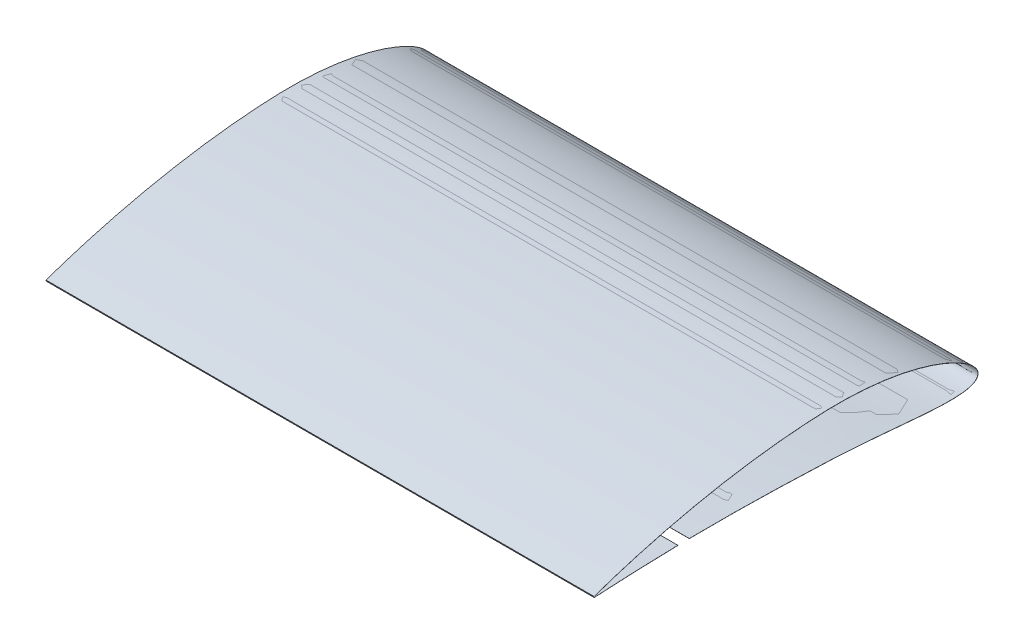
ISO-10303-21;
HEADER;
FILE_DESCRIPTION(('STEP AP214'),'2;1');
FILE_NAME('part.step','',(''),(''),'','','');
FILE_SCHEMA(('AUTOMOTIVE_DESIGN { 1 0 10303 214 1 1 1 1 }'));
ENDSEC;
DATA;
#1=APPLICATION_CONTEXT('core data for automotive mechanical design processes');
#2=APPLICATION_PROTOCOL_DEFINITION('international standard','automotive_design',2000,#1);
#3=PRODUCT_CONTEXT('',#1,'mechanical');
#4=PRODUCT('Part','Part','',(#3));
#5=PRODUCT_RELATED_PRODUCT_CATEGORY('part','',(#4));
#6=PRODUCT_DEFINITION_FORMATION('','',#4);
#7=PRODUCT_DEFINITION_CONTEXT('part definition',#1,'design');
#8=PRODUCT_DEFINITION('design','',#6,#7);
#9=PRODUCT_DEFINITION_SHAPE('','',#8);
#10=(LENGTH_UNIT() NAMED_UNIT(*) SI_UNIT(.MILLI.,.METRE.));
#11=(NAMED_UNIT(*) PLANE_ANGLE_UNIT() SI_UNIT($,.RADIAN.));
#12=(NAMED_UNIT(*) SI_UNIT($,.STERADIAN.) SOLID_ANGLE_UNIT());
#13=UNCERTAINTY_MEASURE_WITH_UNIT(LENGTH_MEASURE(1.E-05),#10,'distance_accuracy_value','');
#14=(GEOMETRIC_REPRESENTATION_CONTEXT(3) GLOBAL_UNCERTAINTY_ASSIGNED_CONTEXT((#13)) GLOBAL_UNIT_ASSIGNED_CONTEXT((#10,
#11,#12)) REPRESENTATION_CONTEXT('',''));
#15=CARTESIAN_POINT('',(0.,0.,0.));
#16=DIRECTION('',(0.,0.,1.));
#17=DIRECTION('',(1.,0.,0.));
#18=AXIS2_PLACEMENT_3D('',#15,#16,#17);
#19=CARTESIAN_POINT('',(-254.,-0.0431321443900543,354.886743616797));
#20=CARTESIAN_POINT('',(-254.,-0.178279335017485,354.878804644501));
#21=CARTESIAN_POINT('',(-254.,-0.392167923023726,354.877800433398));
#22=CARTESIAN_POINT('',(-254.,-0.620573956131464,354.718790465222));
#23=CARTESIAN_POINT('',(-254.,-0.699431404888376,354.471117086139));
#24=CARTESIAN_POINT('',(-254.,-0.643391604614161,354.133565704868));
#25=CARTESIAN_POINT('',(-254.,-0.459361570220994,353.534718925284));
#26=CARTESIAN_POINT('',(-254.,-0.324844179542978,352.878616178941));
#27=CARTESIAN_POINT('',(-254.,-0.27514866058284,352.169529456319));
#28=CARTESIAN_POINT('',(-254.,-0.291364997161076,351.509080841357));
#29=CARTESIAN_POINT('',(-254.,-0.345792204322244,350.641754644194));
#30=CARTESIAN_POINT('',(-254.,-0.343114155746738,349.495155440037));
#31=CARTESIAN_POINT('',(-254.,-0.249421828721012,348.057709575748));
#32=CARTESIAN_POINT('',(-254.,-0.0683409139707036,346.09921367213));
#33=CARTESIAN_POINT('',(-254.,0.118397326762072,343.684829350942));
#34=CARTESIAN_POINT('',(-254.,0.246984364997534,340.852436226817));
#35=CARTESIAN_POINT('',(-254.,0.367249929772089,338.020999346115));
#36=CARTESIAN_POINT('',(-254.,0.511580201986155,335.168021523029));
#37=CARTESIAN_POINT('',(-254.,0.714636978192544,331.352247356491));
#38=CARTESIAN_POINT('',(-254.,0.954928724606601,326.586197895792));
#39=CARTESIAN_POINT('',(-254.,1.20681195225131,320.88144930632));
#40=CARTESIAN_POINT('',(-254.,1.4473300056571,315.170675093735));
#41=CARTESIAN_POINT('',(-254.,1.67257875389077,309.456624124699));
#42=CARTESIAN_POINT('',(-254.,1.87730273842811,303.742775876454));
#43=CARTESIAN_POINT('',(-254.,2.12372376162243,296.124627961158));
#44=CARTESIAN_POINT('',(-254.,2.39172835372233,286.600178357651));
#45=CARTESIAN_POINT('',(-254.,2.63795629291167,275.168693373375));
#46=CARTESIAN_POINT('',(-254.,2.80252002889444,263.735979270128));
#47=CARTESIAN_POINT('',(-254.,2.89686079810874,252.302341578548));
#48=CARTESIAN_POINT('',(-254.,2.92556966555313,237.057017739622));
#49=CARTESIAN_POINT('',(-254.,2.77937112569216,218.000758012457));
#50=CARTESIAN_POINT('',(-254.,2.34538736185869,195.136294847587));
#51=CARTESIAN_POINT('',(-254.,1.80135309644542,176.087168980662));
#52=CARTESIAN_POINT('',(-254.,1.27469711910108,160.850436224513));
#53=CARTESIAN_POINT('',(-254.,0.757519293384525,145.613201917085));
#54=CARTESIAN_POINT('',(-254.,-0.0488647393760955,126.573365315217));
#55=CARTESIAN_POINT('',(-254.,-1.37544137231911,107.563138919971));
#56=CARTESIAN_POINT('',(-254.,-2.62781678175332,92.3688742568962));
#57=CARTESIAN_POINT('',(-254.,-3.6300548372849,80.9785899080022));
#58=CARTESIAN_POINT('',(-254.,-4.65595537981645,69.590216516382));
#59=CARTESIAN_POINT('',(-254.,-5.65786319372925,58.1991462892872));
#60=CARTESIAN_POINT('',(-254.,-6.41437981224258,48.6990829317655));
#61=CARTESIAN_POINT('',(-254.,-6.91222731474488,41.0906052218664));
#62=CARTESIAN_POINT('',(-254.,-7.21160877146256,35.379234272906));
#63=CARTESIAN_POINT('',(-254.,-7.40932183564488,29.6624563206879));
#64=CARTESIAN_POINT('',(-254.,-7.46425179444419,23.9414429696426));
#65=CARTESIAN_POINT('',(-254.,-7.30798707313279,18.2203220241415));
#66=CARTESIAN_POINT('',(-254.,-6.9197556334194,13.4587607781288));
#67=CARTESIAN_POINT('',(-254.,-6.33050106461964,9.68187611695184));
#68=CARTESIAN_POINT('',(-254.,-5.6940297470881,6.88512122340968));
#69=CARTESIAN_POINT('',(-254.,-4.7762987938631,4.14270319792107));
#70=CARTESIAN_POINT('',(-254.,-3.41757820307539,1.577222389026));
#71=CARTESIAN_POINT('',(-254.,-1.55951143606703,-0.143098612522162));
#72=CARTESIAN_POINT('',(-254.,0.27334805736061,-0.852938138221397));
#73=CARTESIAN_POINT('',(-254.,1.74964451434994,-0.959702576159667));
#74=CARTESIAN_POINT('',(-254.,3.22540437268725,-0.734728016148001));
#75=CARTESIAN_POINT('',(-254.,5.05905962123868,-0.0801726152191487));
#76=CARTESIAN_POINT('',(-254.,7.1001212162409,1.24439324956485));
#77=CARTESIAN_POINT('',(-254.,9.26941260174496,3.14063277116925));
#78=CARTESIAN_POINT('',(-254.,11.8748798112987,5.9467721548671));
#79=CARTESIAN_POINT('',(-254.,14.742035881579,9.77578941990615));
#80=CARTESIAN_POINT('',(-254.,17.7675222960399,14.6454674593734));
#81=CARTESIAN_POINT('',(-254.,20.4843822656892,19.6856425336971));
#82=CARTESIAN_POINT('',(-254.,22.9519540316381,24.8508878619448));
#83=CARTESIAN_POINT('',(-254.,25.9544130672521,31.8675816038441));
#84=CARTESIAN_POINT('',(-254.,29.2404948994926,40.824113666365));
#85=CARTESIAN_POINT('',(-254.,32.5620061255901,51.7773444999431));
#86=CARTESIAN_POINT('',(-254.,35.3318793771696,62.8814351731684));
#87=CARTESIAN_POINT('',(-254.,37.594417698218,74.0988563765813));
#88=CARTESIAN_POINT('',(-254.,39.9794755331792,89.1681202127049));
#89=CARTESIAN_POINT('',(-254.,41.8637677422164,108.154229954747));
#90=CARTESIAN_POINT('',(-254.,42.4798429209608,131.039776119875));
#91=CARTESIAN_POINT('',(-254.,41.5864789099038,153.906158518146));
#92=CARTESIAN_POINT('',(-254.,39.8271836936583,176.714275569098));
#93=CARTESIAN_POINT('',(-254.,37.3011907170268,199.450230249336));
#94=CARTESIAN_POINT('',(-254.,32.9445456132408,229.639462395631));
#95=CARTESIAN_POINT('',(-254.,25.7747866483641,267.096515494306));
#96=CARTESIAN_POINT('',(-254.,16.4649919660654,304.078052972751));
#97=CARTESIAN_POINT('',(-254.,7.76743874974292,333.311697469308));
#98=CARTESIAN_POINT('',(-254.,2.95972002225229,347.783593070607));
#99=CARTESIAN_POINT('',(-254.,0.4764541588744,354.991498919874));
#100=B_SPLINE_CURVE_WITH_KNOTS('',3,(#19,#20,#21,#22,#23,#24,#25,#26,#27,#28,#29,#30,#31,#32,
#33,#34,#35,#36,#37,#38,#39,#40,#41,#42,#43,#44,#45,#46,#47,#48,#49,#50,#51,#52,#53,#54,#55,#56,
#57,#58,#59,#60,#61,#62,#63,#64,#65,#66,#67,#68,#69,#70,#71,#72,#73,#74,#75,#76,#77,#78,#79,#80,
#81,#82,#83,#84,#85,#86,#87,#88,#89,#90,#91,#92,#93,#94,#95,#96,#97,#98,#99),.UNSPECIFIED.,.F.,
.F.,(4,1,1,1,1,1,1,1,1,1,1,1,1,1,1,1,1,1,1,1,1,1,1,1,1,1,1,1,1,1,1,1,1,1,1,1,1,1,1,1,1,1,1,1,1,
1,1,1,1,1,1,1,1,1,1,1,1,1,1,1,1,1,1,1,1,1,1,1,1,1,1,1,1,1,1,1,1,1,4),(-0.000119615790120337,
0.000368719796214317,0.000612887589381588,0.00085705538254886,0.0013453909688834,
0.00183372655521795,0.00281039772788714,0.00378706890055634,0.00476374007322542,
0.00574041124589462,0.0076937535912329,0.00964709593657119,0.0116004382819095,0.015507122972586,
0.0194138076632626,0.0233204923539393,0.027227177044616,0.0311338617352925,0.0389472311166458,
0.046760600497999,0.0545739698793522,0.0623873392607055,0.0702007086420587,0.078014078023412,
0.0936408167861184,0.109267555548825,0.124894294311531,0.140521033074238,0.156147771836944,
0.187401249362357,0.21865472688777,0.249908204413183,0.26553494317589,0.281161681938596,
0.312415159464009,0.343668636989422,0.359295375752128,0.374922114514835,0.390548853277541,
0.406175592040248,0.421802330802954,0.429615700184307,0.437429069565661,0.445242438947014,
0.453055808328367,0.46086917770972,0.468682547091074,0.47258923178175,0.476495916472427,
0.480402601163104,0.48430928585378,0.488215970544457,0.490169312889795,0.492122655235133,
0.494075997580471,0.49602933992581,0.499936024616486,0.503842709307163,0.50774939399784,
0.515562763379193,0.523376132760546,0.531189502141899,0.539002871523253,0.546816240904606,
0.562442979667312,0.578069718430019,0.593696457192725,0.609323195955432,0.624949934718138,
0.656203412243551,0.687456889768964,0.718710367294377,0.74996384481979,0.781217322345203,
0.812470799870616,0.874977754921442,0.937484709972267,0.96873818749768,0.999991665023093),.UNSPECIFIED.);
#101=DIRECTION('',(1.,0.,0.));
#102=VECTOR('',#101,1.);
#103=SURFACE_OF_LINEAR_EXTRUSION('',#100,#102);
#104=DIRECTION('',(1.,0.,0.));
#105=VECTOR('',#104,1.);
#106=CARTESIAN_POINT('',(-254.,2.58468570330583,277.297448822025));
#107=LINE('',#106,#105);
#108=CARTESIAN_POINT('',(254.,2.58468571174382,277.297448818091));
#109=VERTEX_POINT('',#108);
#110=CARTESIAN_POINT('',(-254.,2.58468571174382,277.297448818091));
#111=VERTEX_POINT('',#110);
#112=EDGE_CURVE('E121',#109,#111,#107,.F.);
#113=ORIENTED_EDGE('',*,*,#112,.F.);
#114=CARTESIAN_POINT('',(254.,-0.0431321443900543,354.886743616797));
#115=CARTESIAN_POINT('',(254.,-0.178279335017485,354.878804644501));
#116=CARTESIAN_POINT('',(254.,-0.392167923023726,354.877800433398));
#117=CARTESIAN_POINT('',(254.,-0.620573956131464,354.718790465222));
#118=CARTESIAN_POINT('',(254.,-0.699431404888376,354.471117086139));
#119=CARTESIAN_POINT('',(254.,-0.643391604614161,354.133565704868));
#120=CARTESIAN_POINT('',(254.,-0.459361570220994,353.534718925284));
#121=CARTESIAN_POINT('',(254.,-0.324844179542978,352.878616178941));
#122=CARTESIAN_POINT('',(254.,-0.27514866058284,352.169529456319));
#123=CARTESIAN_POINT('',(254.,-0.291364997161076,351.509080841357));
#124=CARTESIAN_POINT('',(254.,-0.345792204322244,350.641754644194));
#125=CARTESIAN_POINT('',(254.,-0.343114155746738,349.495155440037));
#126=CARTESIAN_POINT('',(254.,-0.249421828721012,348.057709575748));
#127=CARTESIAN_POINT('',(254.,-0.0683409139707036,346.09921367213));
#128=CARTESIAN_POINT('',(254.,0.118397326762072,343.684829350942));
#129=CARTESIAN_POINT('',(254.,0.246984364997534,340.852436226817));
#130=CARTESIAN_POINT('',(254.,0.367249929772089,338.020999346115));
#131=CARTESIAN_POINT('',(254.,0.511580201986155,335.168021523029));
#132=CARTESIAN_POINT('',(254.,0.714636978192544,331.352247356491));
#133=CARTESIAN_POINT('',(254.,0.954928724606601,326.586197895792));
#134=CARTESIAN_POINT('',(254.,1.20681195225131,320.88144930632));
#135=CARTESIAN_POINT('',(254.,1.4473300056571,315.170675093735));
#136=CARTESIAN_POINT('',(254.,1.67257875389077,309.456624124699));
#137=CARTESIAN_POINT('',(254.,1.87730273842811,303.742775876454));
#138=CARTESIAN_POINT('',(254.,2.12372376162243,296.124627961158));
#139=CARTESIAN_POINT('',(254.,2.39172835372233,286.600178357651));
#140=CARTESIAN_POINT('',(254.,2.63795629291167,275.168693373375));
#141=CARTESIAN_POINT('',(254.,2.80252002889444,263.735979270128));
#142=CARTESIAN_POINT('',(254.,2.89686079810874,252.302341578548));
#143=CARTESIAN_POINT('',(254.,2.92556966555313,237.057017739622));
#144=CARTESIAN_POINT('',(254.,2.77937112569216,218.000758012457));
#145=CARTESIAN_POINT('',(254.,2.34538736185869,195.136294847587));
#146=CARTESIAN_POINT('',(254.,1.80135309644542,176.087168980662));
#147=CARTESIAN_POINT('',(254.,1.27469711910108,160.850436224513));
#148=CARTESIAN_POINT('',(254.,0.757519293384525,145.613201917085));
#149=CARTESIAN_POINT('',(254.,-0.0488647393760955,126.573365315217));
#150=CARTESIAN_POINT('',(254.,-1.37544137231911,107.563138919971));
#151=CARTESIAN_POINT('',(254.,-2.62781678175332,92.3688742568962));
#152=CARTESIAN_POINT('',(254.,-3.6300548372849,80.9785899080022));
#153=CARTESIAN_POINT('',(254.,-4.65595537981645,69.590216516382));
#154=CARTESIAN_POINT('',(254.,-5.65786319372925,58.1991462892872));
#155=CARTESIAN_POINT('',(254.,-6.41437981224258,48.6990829317655));
#156=CARTESIAN_POINT('',(254.,-6.91222731474488,41.0906052218664));
#157=CARTESIAN_POINT('',(254.,-7.21160877146256,35.379234272906));
#158=CARTESIAN_POINT('',(254.,-7.40932183564488,29.6624563206879));
#159=CARTESIAN_POINT('',(254.,-7.46425179444419,23.9414429696426));
#160=CARTESIAN_POINT('',(254.,-7.30798707313279,18.2203220241415));
#161=CARTESIAN_POINT('',(254.,-6.9197556334194,13.4587607781288));
#162=CARTESIAN_POINT('',(254.,-6.33050106461964,9.68187611695184));
#163=CARTESIAN_POINT('',(254.,-5.6940297470881,6.88512122340968));
#164=CARTESIAN_POINT('',(254.,-4.7762987938631,4.14270319792107));
#165=CARTESIAN_POINT('',(254.,-3.41757820307539,1.577222389026));
#166=CARTESIAN_POINT('',(254.,-1.55951143606703,-0.143098612522162));
#167=CARTESIAN_POINT('',(254.,0.27334805736061,-0.852938138221397));
#168=CARTESIAN_POINT('',(254.,1.74964451434994,-0.959702576159667));
#169=CARTESIAN_POINT('',(254.,3.22540437268725,-0.734728016148001));
#170=CARTESIAN_POINT('',(254.,5.05905962123868,-0.0801726152191487));
#171=CARTESIAN_POINT('',(254.,7.1001212162409,1.24439324956485));
#172=CARTESIAN_POINT('',(254.,9.26941260174496,3.14063277116925));
#173=CARTESIAN_POINT('',(254.,11.8748798112987,5.9467721548671));
#174=CARTESIAN_POINT('',(254.,14.742035881579,9.77578941990615));
#175=CARTESIAN_POINT('',(254.,17.7675222960399,14.6454674593734));
#176=CARTESIAN_POINT('',(254.,20.4843822656892,19.6856425336971));
#177=CARTESIAN_POINT('',(254.,22.9519540316381,24.8508878619448));
#178=CARTESIAN_POINT('',(254.,25.9544130672521,31.8675816038441));
#179=CARTESIAN_POINT('',(254.,29.2404948994926,40.824113666365));
#180=CARTESIAN_POINT('',(254.,32.5620061255901,51.7773444999431));
#181=CARTESIAN_POINT('',(254.,35.3318793771696,62.8814351731684));
#182=CARTESIAN_POINT('',(254.,37.594417698218,74.0988563765813));
#183=CARTESIAN_POINT('',(254.,39.9794755331792,89.1681202127049));
#184=CARTESIAN_POINT('',(254.,41.8637677422164,108.154229954747));
#185=CARTESIAN_POINT('',(254.,42.4798429209608,131.039776119875));
#186=CARTESIAN_POINT('',(254.,41.5864789099038,153.906158518146));
#187=CARTESIAN_POINT('',(254.,39.8271836936583,176.714275569098));
#188=CARTESIAN_POINT('',(254.,37.3011907170268,199.450230249336));
#189=CARTESIAN_POINT('',(254.,32.9445456132408,229.639462395631));
#190=CARTESIAN_POINT('',(254.,25.7747866483641,267.096515494306));
#191=CARTESIAN_POINT('',(254.,16.4649919660654,304.078052972751));
#192=CARTESIAN_POINT('',(254.,7.76743874974292,333.311697469308));
#193=CARTESIAN_POINT('',(254.,2.95972002225229,347.783593070607));
#194=CARTESIAN_POINT('',(254.,0.4764541588744,354.991498919874));
#195=B_SPLINE_CURVE_WITH_KNOTS('',3,(#114,#115,#116,#117,#118,#119,#120,#121,#122,#123,#124,
#125,#126,#127,#128,#129,#130,#131,#132,#133,#134,#135,#136,#137,#138,#139,#140,#141,#142,#143,
#144,#145,#146,#147,#148,#149,#150,#151,#152,#153,#154,#155,#156,#157,#158,#159,#160,#161,#162,
#163,#164,#165,#166,#167,#168,#169,#170,#171,#172,#173,#174,#175,#176,#177,#178,#179,#180,#181,
#182,#183,#184,#185,#186,#187,#188,#189,#190,#191,#192,#193,#194),.UNSPECIFIED.,.F.,.F.,(4,1,1,
1,1,1,1,1,1,1,1,1,1,1,1,1,1,1,1,1,1,1,1,1,1,1,1,1,1,1,1,1,1,1,1,1,1,1,1,1,1,1,1,1,1,1,1,1,1,1,1,
1,1,1,1,1,1,1,1,1,1,1,1,1,1,1,1,1,1,1,1,1,1,1,1,1,1,1,4),(-0.000119615790120337,
0.000368719796214317,0.000612887589381588,0.00085705538254886,0.0013453909688834,
0.00183372655521795,0.00281039772788714,0.00378706890055634,0.00476374007322542,
0.00574041124589462,0.0076937535912329,0.00964709593657119,0.0116004382819095,0.015507122972586,
0.0194138076632626,0.0233204923539393,0.027227177044616,0.0311338617352925,0.0389472311166458,
0.046760600497999,0.0545739698793522,0.0623873392607055,0.0702007086420587,0.078014078023412,
0.0936408167861184,0.109267555548825,0.124894294311531,0.140521033074238,0.156147771836944,
0.187401249362357,0.21865472688777,0.249908204413183,0.26553494317589,0.281161681938596,
0.312415159464009,0.343668636989422,0.359295375752128,0.374922114514835,0.390548853277541,
0.406175592040248,0.421802330802954,0.429615700184307,0.437429069565661,0.445242438947014,
0.453055808328367,0.46086917770972,0.468682547091074,0.47258923178175,0.476495916472427,
0.480402601163104,0.48430928585378,0.488215970544457,0.490169312889795,0.492122655235133,
0.494075997580471,0.49602933992581,0.499936024616486,0.503842709307163,0.50774939399784,
0.515562763379193,0.523376132760546,0.531189502141899,0.539002871523253,0.546816240904606,
0.562442979667312,0.578069718430019,0.593696457192725,0.609323195955432,0.624949934718138,
0.656203412243551,0.687456889768964,0.718710367294377,0.74996384481979,0.781217322345203,
0.812470799870616,0.874977754921442,0.937484709972267,0.96873818749768,0.999991665023093),.UNSPECIFIED.);
#196=CARTESIAN_POINT('',(254.,-0.0431321443900543,354.886743616797));
#197=VERTEX_POINT('',#196);
#198=EDGE_CURVE('E134',#197,#109,#195,.T.);
#199=ORIENTED_EDGE('',*,*,#198,.F.);
#200=DIRECTION('',(1.,0.,0.));
#201=VECTOR('',#200,1.);
#202=CARTESIAN_POINT('',(-254.,-0.0431321443900543,354.886743616797));
#203=LINE('',#202,#201);
#204=CARTESIAN_POINT('',(-254.,-0.0431321443900543,354.886743616797));
#205=VERTEX_POINT('',#204);
#206=EDGE_CURVE('E105',#205,#197,#203,.T.);
#207=ORIENTED_EDGE('',*,*,#206,.F.);
#208=EDGE_CURVE('E183',#205,#111,#100,.T.);
#209=ORIENTED_EDGE('',*,*,#208,.T.);
#210=EDGE_LOOP('',(#113,#199,#207,#209));
#211=FACE_BOUND('',#210,.T.);
#212=ADVANCED_FACE('F36',(#211),#103,.T.);
#213=CARTESIAN_POINT('',(-254.,-0.0302571964763549,354.787327227915));
#214=CARTESIAN_POINT('',(-254.,-0.202511549774369,354.777220058735));
#215=CARTESIAN_POINT('',(-254.,-0.758116619532224,354.744619463571));
#216=CARTESIAN_POINT('',(-254.,-0.0353878265544988,352.780150329408));
#217=CARTESIAN_POINT('',(-254.,-0.406394891328532,350.227621537646));
#218=CARTESIAN_POINT('',(-254.,0.191518705423128,345.076973542852));
#219=CARTESIAN_POINT('',(-254.,0.426846954997304,338.388880463138));
#220=CARTESIAN_POINT('',(-254.,0.912902226587254,329.767358245601));
#221=CARTESIAN_POINT('',(-254.,1.37107480853054,319.513378005819));
#222=CARTESIAN_POINT('',(-254.,1.85212662662604,307.681856469284));
#223=CARTESIAN_POINT('',(-254.,2.2828903737653,294.437996631764));
#224=CARTESIAN_POINT('',(-254.,2.65636592644588,279.933149694368));
#225=CARTESIAN_POINT('',(-254.,2.90744759821903,264.337268620967));
#226=CARTESIAN_POINT('',(-254.,3.02848065946825,247.830237404837));
#227=CARTESIAN_POINT('',(-254.,2.97910623211237,224.541124113717));
#228=CARTESIAN_POINT('',(-254.,2.58624656268472,200.671973719441));
#229=CARTESIAN_POINT('',(-254.,1.91789319340299,176.483884619505));
#230=CARTESIAN_POINT('',(-254.,1.28674404323604,158.296467958687));
#231=CARTESIAN_POINT('',(-254.,0.674535202653767,140.48477689744));
#232=CARTESIAN_POINT('',(-254.,-0.458414507964394,117.937239158073));
#233=CARTESIAN_POINT('',(-254.,-2.15355585803942,96.4067365521407));
#234=CARTESIAN_POINT('',(-254.,-3.98391169785236,75.9298626432168));
#235=CARTESIAN_POINT('',(-254.,-5.23803481691952,61.9523939500743));
#236=CARTESIAN_POINT('',(-254.,-6.3018667845873,49.0830780174977));
#237=CARTESIAN_POINT('',(-254.,-7.05379709208437,37.4470572233417));
#238=CARTESIAN_POINT('',(-254.,-7.40487495085787,27.1638266260831));
#239=CARTESIAN_POINT('',(-254.,-7.26852765592077,18.3491197902741));
#240=CARTESIAN_POINT('',(-254.,-6.58746462442697,11.0873159681167));
#241=CARTESIAN_POINT('',(-254.,-5.28808573883758,5.4507808849597));
#242=CARTESIAN_POINT('',(-254.,-3.30894318563573,1.35108725963543));
#243=CARTESIAN_POINT('',(-254.,-0.148325215865237,-0.987487677240321));
#244=CARTESIAN_POINT('',(-254.,3.7967578133831,-0.765838064798878));
#245=CARTESIAN_POINT('',(-254.,7.71649979382027,1.67922407257184));
#246=CARTESIAN_POINT('',(-254.,11.8553419578337,5.92689766090299));
#247=CARTESIAN_POINT('',(-254.,16.2262899348965,12.1072031542234));
#248=CARTESIAN_POINT('',(-254.,20.7343193498453,20.187014187513));
#249=CARTESIAN_POINT('',(-254.,25.2201252971746,30.130463623116));
#250=CARTESIAN_POINT('',(-254.,29.5108543834638,41.8433907768923));
#251=CARTESIAN_POINT('',(-254.,33.4329059974258,55.1997604360673));
#252=CARTESIAN_POINT('',(-254.,36.8104805743368,70.0434509571498));
#253=CARTESIAN_POINT('',(-254.,39.4786761807971,86.1884085277303));
#254=CARTESIAN_POINT('',(-254.,41.32105063238,103.42216726238));
#255=CARTESIAN_POINT('',(-254.,42.2288581946823,121.516747473044));
#256=CARTESIAN_POINT('',(-254.,42.1113766684293,140.09669102153));
#257=CARTESIAN_POINT('',(-254.,41.1132128906756,158.902335219002));
#258=CARTESIAN_POINT('',(-254.,39.0904540579609,183.961657870227));
#259=CARTESIAN_POINT('',(-254.,36.0047557168601,208.774809212926));
#260=CARTESIAN_POINT('',(-254.,31.1455287976255,238.622276389231));
#261=CARTESIAN_POINT('',(-254.,26.6515697314507,261.175777938493));
#262=CARTESIAN_POINT('',(-254.,21.7242725259394,282.422876263721));
#263=CARTESIAN_POINT('',(-254.,17.1306006385399,300.598349456261));
#264=CARTESIAN_POINT('',(-254.,11.7988919274353,319.654473711953));
#265=CARTESIAN_POINT('',(-254.,6.72155114802005,336.024074691811));
#266=CARTESIAN_POINT('',(-254.,3.49779827393597,345.800950265157));
#267=CARTESIAN_POINT('',(-254.,1.92709586834348,350.478726649503));
#268=CARTESIAN_POINT('',(-254.,0.953557869568799,353.29965963041));
#269=CARTESIAN_POINT('',(-254.,0.519388000117919,354.559877308969));
#270=CARTESIAN_POINT('',(-254.,0.410417886541196,354.876173010782));
#271=B_SPLINE_CURVE_WITH_KNOTS('',3,(#213,#214,#215,#216,#217,#218,#219,#220,#221,#222,#223,
#224,#225,#226,#227,#228,#229,#230,#231,#232,#233,#234,#235,#236,#237,#238,#239,#240,#241,#242,
#243,#244,#245,#246,#247,#248,#249,#250,#251,#252,#253,#254,#255,#256,#257,#258,#259,#260,#261,
#262,#263,#264,#265,#266,#267,#268,#269,#270),.UNSPECIFIED.,.F.,.F.,(4,1,1,1,1,1,1,1,1,1,1,1,1,
1,1,1,1,1,1,1,1,1,1,1,1,1,1,1,1,1,1,1,1,1,1,1,1,1,1,1,1,1,1,1,1,1,1,1,1,1,1,1,1,1,1,4),(0.,
0.00061435602735338,0.00198160056276364,0.00606849911990259,0.0128259983002053,
0.0221600600259541,0.0339528411484215,0.0480573219049674,0.0643016527838605,0.0824806064748046,
0.102390013464696,0.123786894847983,0.146429707819126,0.170067604158041,0.219268231220122,
0.244299756437978,0.269272617042279,0.293879334559277,0.317367886846568,0.361825599196296,
0.382415541627446,0.401655123624231,0.419361860817184,0.435356743556399,0.44945739068769,
0.461534248286615,0.471483960270294,0.479298491667603,0.485175806315722,0.489815015537041,
0.49445371882196,0.500384211459872,0.508369297965653,0.518670584727767,0.531320006060474,
0.54625561026072,0.563345994084458,0.58242326585592,0.60328874622392,0.625720296766354,
0.649474912467889,0.674310012117921,0.699958821683972,0.725614899189679,0.751503233324799,
0.803021620411888,0.828087427427487,0.875472920842336,0.897280851310736,0.917503738861992,
0.952328750245583,0.978398030734231,0.987765198149775,0.994535224157492,0.998628423374974,1.),.UNSPECIFIED.);
#272=DIRECTION('',(1.,0.,0.));
#273=VECTOR('',#272,1.);
#274=SURFACE_OF_LINEAR_EXTRUSION('',#271,#273);
#275=CARTESIAN_POINT('',(254.,-0.0302571964763549,354.787327227915));
#276=CARTESIAN_POINT('',(254.,-0.202511549774369,354.777220058735));
#277=CARTESIAN_POINT('',(254.,-0.758116619532224,354.744619463571));
#278=CARTESIAN_POINT('',(254.,-0.0353878265544988,352.780150329408));
#279=CARTESIAN_POINT('',(254.,-0.406394891328532,350.227621537646));
#280=CARTESIAN_POINT('',(254.,0.191518705423128,345.076973542852));
#281=CARTESIAN_POINT('',(254.,0.426846954997304,338.388880463138));
#282=CARTESIAN_POINT('',(254.,0.912902226587254,329.767358245601));
#283=CARTESIAN_POINT('',(254.,1.37107480853054,319.513378005819));
#284=CARTESIAN_POINT('',(254.,1.85212662662604,307.681856469284));
#285=CARTESIAN_POINT('',(254.,2.2828903737653,294.437996631764));
#286=CARTESIAN_POINT('',(254.,2.65636592644588,279.933149694368));
#287=CARTESIAN_POINT('',(254.,2.90744759821903,264.337268620967));
#288=CARTESIAN_POINT('',(254.,3.02848065946825,247.830237404837));
#289=CARTESIAN_POINT('',(254.,2.97910623211237,224.541124113717));
#290=CARTESIAN_POINT('',(254.,2.58624656268472,200.671973719441));
#291=CARTESIAN_POINT('',(254.,1.91789319340299,176.483884619505));
#292=CARTESIAN_POINT('',(254.,1.28674404323604,158.296467958687));
#293=CARTESIAN_POINT('',(254.,0.674535202653767,140.48477689744));
#294=CARTESIAN_POINT('',(254.,-0.458414507964394,117.937239158073));
#295=CARTESIAN_POINT('',(254.,-2.15355585803942,96.4067365521407));
#296=CARTESIAN_POINT('',(254.,-3.98391169785236,75.9298626432168));
#297=CARTESIAN_POINT('',(254.,-5.23803481691952,61.9523939500743));
#298=CARTESIAN_POINT('',(254.,-6.3018667845873,49.0830780174977));
#299=CARTESIAN_POINT('',(254.,-7.05379709208437,37.4470572233417));
#300=CARTESIAN_POINT('',(254.,-7.40487495085787,27.1638266260831));
#301=CARTESIAN_POINT('',(254.,-7.26852765592077,18.3491197902741));
#302=CARTESIAN_POINT('',(254.,-6.58746462442697,11.0873159681167));
#303=CARTESIAN_POINT('',(254.,-5.28808573883758,5.4507808849597));
#304=CARTESIAN_POINT('',(254.,-3.30894318563573,1.35108725963543));
#305=CARTESIAN_POINT('',(254.,-0.148325215865237,-0.987487677240321));
#306=CARTESIAN_POINT('',(254.,3.7967578133831,-0.765838064798878));
#307=CARTESIAN_POINT('',(254.,7.71649979382027,1.67922407257184));
#308=CARTESIAN_POINT('',(254.,11.8553419578337,5.92689766090299));
#309=CARTESIAN_POINT('',(254.,16.2262899348965,12.1072031542234));
#310=CARTESIAN_POINT('',(254.,20.7343193498453,20.187014187513));
#311=CARTESIAN_POINT('',(254.,25.2201252971746,30.130463623116));
#312=CARTESIAN_POINT('',(254.,29.5108543834638,41.8433907768923));
#313=CARTESIAN_POINT('',(254.,33.4329059974258,55.1997604360673));
#314=CARTESIAN_POINT('',(254.,36.8104805743368,70.0434509571498));
#315=CARTESIAN_POINT('',(254.,39.4786761807971,86.1884085277303));
#316=CARTESIAN_POINT('',(254.,41.32105063238,103.42216726238));
#317=CARTESIAN_POINT('',(254.,42.2288581946823,121.516747473044));
#318=CARTESIAN_POINT('',(254.,42.1113766684293,140.09669102153));
#319=CARTESIAN_POINT('',(254.,41.1132128906756,158.902335219002));
#320=CARTESIAN_POINT('',(254.,39.0904540579609,183.961657870227));
#321=CARTESIAN_POINT('',(254.,36.0047557168601,208.774809212926));
#322=CARTESIAN_POINT('',(254.,31.1455287976255,238.622276389231));
#323=CARTESIAN_POINT('',(254.,26.6515697314507,261.175777938493));
#324=CARTESIAN_POINT('',(254.,21.7242725259394,282.422876263721));
#325=CARTESIAN_POINT('',(254.,17.1306006385399,300.598349456261));
#326=CARTESIAN_POINT('',(254.,11.7988919274353,319.654473711953));
#327=CARTESIAN_POINT('',(254.,6.72155114802005,336.024074691811));
#328=CARTESIAN_POINT('',(254.,3.49779827393597,345.800950265157));
#329=CARTESIAN_POINT('',(254.,1.92709586834348,350.478726649503));
#330=CARTESIAN_POINT('',(254.,0.953557869568799,353.29965963041));
#331=CARTESIAN_POINT('',(254.,0.519388000117919,354.559877308969));
#332=CARTESIAN_POINT('',(254.,0.410417886541196,354.876173010782));
#333=B_SPLINE_CURVE_WITH_KNOTS('',3,(#275,#276,#277,#278,#279,#280,#281,#282,#283,#284,#285,
#286,#287,#288,#289,#290,#291,#292,#293,#294,#295,#296,#297,#298,#299,#300,#301,#302,#303,#304,
#305,#306,#307,#308,#309,#310,#311,#312,#313,#314,#315,#316,#317,#318,#319,#320,#321,#322,#323,
#324,#325,#326,#327,#328,#329,#330,#331,#332),.UNSPECIFIED.,.F.,.F.,(4,1,1,1,1,1,1,1,1,1,1,1,1,
1,1,1,1,1,1,1,1,1,1,1,1,1,1,1,1,1,1,1,1,1,1,1,1,1,1,1,1,1,1,1,1,1,1,1,1,1,1,1,1,1,1,4),(0.,
0.00061435602735338,0.00198160056276364,0.00606849911990259,0.0128259983002053,
0.0221600600259541,0.0339528411484215,0.0480573219049674,0.0643016527838605,0.0824806064748046,
0.102390013464696,0.123786894847983,0.146429707819126,0.170067604158041,0.219268231220122,
0.244299756437978,0.269272617042279,0.293879334559277,0.317367886846568,0.361825599196296,
0.382415541627446,0.401655123624231,0.419361860817184,0.435356743556399,0.44945739068769,
0.461534248286615,0.471483960270294,0.479298491667603,0.485175806315722,0.489815015537041,
0.49445371882196,0.500384211459872,0.508369297965653,0.518670584727767,0.531320006060474,
0.54625561026072,0.563345994084458,0.58242326585592,0.60328874622392,0.625720296766354,
0.649474912467889,0.674310012117921,0.699958821683972,0.725614899189679,0.751503233324799,
0.803021620411888,0.828087427427487,0.875472920842336,0.897280851310736,0.917503738861992,
0.952328750245583,0.978398030734231,0.987765198149775,0.994535224157492,0.998628423374974,1.),.UNSPECIFIED.);
#334=CARTESIAN_POINT('',(254.,-0.030257196476355,354.787327227915));
#335=VERTEX_POINT('',#334);
#336=CARTESIAN_POINT('',(254.,2.68576626148836,277.250314184732));
#337=VERTEX_POINT('',#336);
#338=EDGE_CURVE('E120',#335,#337,#333,.T.);
#339=ORIENTED_EDGE('',*,*,#338,.T.);
#340=DIRECTION('',(1.,0.,0.));
#341=VECTOR('',#340,1.);
#342=CARTESIAN_POINT('',(-254.,2.68576626150921,277.250314183645));
#343=LINE('',#342,#341);
#344=CARTESIAN_POINT('',(-254.,2.68576626107561,277.250314183847));
#345=VERTEX_POINT('',#344);
#346=EDGE_CURVE('E51',#337,#345,#343,.F.);
#347=ORIENTED_EDGE('',*,*,#346,.T.);
#348=CARTESIAN_POINT('',(-254.,-0.0302571964763479,354.787327227915));
#349=VERTEX_POINT('',#348);
#350=EDGE_CURVE('E145',#349,#345,#271,.T.);
#351=ORIENTED_EDGE('',*,*,#350,.F.);
#352=DIRECTION('',(1.,0.,0.));
#353=VECTOR('',#352,1.);
#354=CARTESIAN_POINT('',(-254.,-0.030257196476355,354.787327227915));
#355=LINE('',#354,#353);
#356=EDGE_CURVE('E204',#349,#335,#355,.T.);
#357=ORIENTED_EDGE('',*,*,#356,.T.);
#358=EDGE_LOOP('',(#339,#347,#351,#357));
#359=FACE_BOUND('',#358,.T.);
#360=ADVANCED_FACE('F162',(#359),#274,.F.);
#361=DIRECTION('',(1.,0.,0.));
#362=VECTOR('',#361,1.);
#363=CARTESIAN_POINT('',(-254.,2.75486059949518,266.7));
#364=LINE('',#363,#362);
#365=CARTESIAN_POINT('',(-254.,2.75486059949519,266.7));
#366=VERTEX_POINT('',#365);
#367=CARTESIAN_POINT('',(254.,2.75486059949519,266.7));
#368=VERTEX_POINT('',#367);
#369=EDGE_CURVE('E59',#366,#368,#364,.T.);
#370=ORIENTED_EDGE('',*,*,#369,.F.);
#371=CARTESIAN_POINT('',(-254.,0.4764541588744,354.991498919874));
#372=VERTEX_POINT('',#371);
#373=EDGE_CURVE('E199',#366,#372,#100,.T.);
#374=ORIENTED_EDGE('',*,*,#373,.T.);
#375=DIRECTION('',(1.,0.,0.));
#376=VECTOR('',#375,1.);
#377=CARTESIAN_POINT('',(-254.,0.4764541588744,354.991498919874));
#378=LINE('',#377,#376);
#379=CARTESIAN_POINT('',(254.,0.4764541588744,354.991498919874));
#380=VERTEX_POINT('',#379);
#381=EDGE_CURVE('E189',#372,#380,#378,.T.);
#382=ORIENTED_EDGE('',*,*,#381,.T.);
#383=EDGE_CURVE('E133',#368,#380,#195,.T.);
#384=ORIENTED_EDGE('',*,*,#383,.F.);
#385=EDGE_LOOP('',(#370,#374,#382,#384));
#386=FACE_BOUND('',#385,.T.);
#387=ADVANCED_FACE('F38',(#386),#103,.T.);
#388=CARTESIAN_POINT('',(-254.,-0.0431321443900543,354.886743616797));
#389=DIRECTION('',(0.,-0.197636177725578,0.980275441523465));
#390=DIRECTION('',(0.,-0.980275441523465,-0.197636177725578));
#391=AXIS2_PLACEMENT_3D('',#388,#389,#390);
#392=PLANE('',#391);
#393=ORIENTED_EDGE('',*,*,#206,.T.);
#394=DIRECTION('',(0.,-0.980275441523465,-0.197636177725578));
#395=VECTOR('',#394,1.);
#396=CARTESIAN_POINT('',(254.,-0.0431321443900543,354.886743616797));
#397=LINE('',#396,#395);
#398=EDGE_CURVE('E139',#380,#197,#397,.T.);
#399=ORIENTED_EDGE('',*,*,#398,.F.);
#400=ORIENTED_EDGE('',*,*,#381,.F.);
#401=DIRECTION('',(0.,-0.980275441523465,-0.197636177725578));
#402=VECTOR('',#401,1.);
#403=CARTESIAN_POINT('',(-254.,-0.0431321443900543,354.886743616797));
#404=LINE('',#403,#402);
#405=EDGE_CURVE('E191',#372,#205,#404,.T.);
#406=ORIENTED_EDGE('',*,*,#405,.T.);
#407=EDGE_LOOP('',(#393,#399,#400,#406));
#408=FACE_BOUND('',#407,.T.);
#409=ADVANCED_FACE('F165',(#408),#392,.T.);
#410=CARTESIAN_POINT('',(-254.,7.05345746149114,1.29551999687546));
#411=DIRECTION('',(1.,0.,0.));
#412=DIRECTION('',(0.,0.,-1.));
#413=AXIS2_PLACEMENT_3D('',#410,#411,#412);
#414=PLANE('',#413);
#415=ORIENTED_EDGE('',*,*,#350,.T.);
#416=DIRECTION('',(0.,-0.90630778703665,0.4226182617407));
#417=VECTOR('',#416,1.);
#418=CARTESIAN_POINT('',(-254.,25.3109880418854,266.7));
#419=LINE('',#418,#417);
#420=EDGE_CURVE('E207',#345,#111,#419,.T.);
#421=ORIENTED_EDGE('',*,*,#420,.T.);
#422=ORIENTED_EDGE('',*,*,#208,.F.);
#423=ORIENTED_EDGE('',*,*,#405,.F.);
#424=ORIENTED_EDGE('',*,*,#373,.F.);
#425=DIRECTION('',(0.,1.,0.));
#426=VECTOR('',#425,1.);
#427=CARTESIAN_POINT('',(-254.,25.3109880418854,266.7));
#428=LINE('',#427,#426);
#429=CARTESIAN_POINT('',(-254.,2.85478886450617,266.7));
#430=VERTEX_POINT('',#429);
#431=EDGE_CURVE('E113',#366,#430,#428,.T.);
#432=ORIENTED_EDGE('',*,*,#431,.T.);
#433=CARTESIAN_POINT('',(-254.,0.410417886541196,354.876173010782));
#434=VERTEX_POINT('',#433);
#435=EDGE_CURVE('E112',#430,#434,#271,.T.);
#436=ORIENTED_EDGE('',*,*,#435,.T.);
#437=DIRECTION('',(0.,-0.980275441523261,-0.197636177726589));
#438=VECTOR('',#437,1.);
#439=CARTESIAN_POINT('',(-254.,-0.030257196476355,354.787327227915));
#440=LINE('',#439,#438);
#441=EDGE_CURVE('E151',#434,#349,#440,.T.);
#442=ORIENTED_EDGE('',*,*,#441,.T.);
#443=EDGE_LOOP('',(#415,#421,#422,#423,#424,#432,#436,#442));
#444=FACE_BOUND('',#443,.T.);
#445=ADVANCED_FACE('F161',(#444),#414,.F.);
#446=ORIENTED_EDGE('',*,*,#435,.F.);
#447=DIRECTION('',(1.,0.,0.));
#448=VECTOR('',#447,1.);
#449=CARTESIAN_POINT('',(-254.,2.85478886450615,266.7));
#450=LINE('',#449,#448);
#451=CARTESIAN_POINT('',(254.,2.85478886450617,266.7));
#452=VERTEX_POINT('',#451);
#453=EDGE_CURVE('E100',#430,#452,#450,.T.);
#454=ORIENTED_EDGE('',*,*,#453,.T.);
#455=CARTESIAN_POINT('',(254.,0.410417886541205,354.876173010782));
#456=VERTEX_POINT('',#455);
#457=EDGE_CURVE('E110',#452,#456,#333,.T.);
#458=ORIENTED_EDGE('',*,*,#457,.T.);
#459=DIRECTION('',(1.,0.,0.));
#460=VECTOR('',#459,1.);
#461=CARTESIAN_POINT('',(-254.,0.410417886541196,354.876173010782));
#462=LINE('',#461,#460);
#463=EDGE_CURVE('E200',#434,#456,#462,.T.);
#464=ORIENTED_EDGE('',*,*,#463,.F.);
#465=EDGE_LOOP('',(#446,#454,#458,#464));
#466=FACE_BOUND('',#465,.T.);
#467=ADVANCED_FACE('F108',(#466),#274,.F.);
#468=CARTESIAN_POINT('',(-254.,-0.030257196476355,354.787327227915));
#469=DIRECTION('',(0.,-0.197636177726589,0.980275441523261));
#470=DIRECTION('',(0.,-0.980275441523261,-0.197636177726589));
#471=AXIS2_PLACEMENT_3D('',#468,#469,#470);
#472=PLANE('',#471);
#473=ORIENTED_EDGE('',*,*,#463,.T.);
#474=DIRECTION('',(0.,-0.980275441523261,-0.197636177726589));
#475=VECTOR('',#474,1.);
#476=CARTESIAN_POINT('',(254.,-0.030257196476355,354.787327227915));
#477=LINE('',#476,#475);
#478=EDGE_CURVE('E119',#456,#335,#477,.T.);
#479=ORIENTED_EDGE('',*,*,#478,.T.);
#480=ORIENTED_EDGE('',*,*,#356,.F.);
#481=ORIENTED_EDGE('',*,*,#441,.F.);
#482=EDGE_LOOP('',(#473,#479,#480,#481));
#483=FACE_BOUND('',#482,.T.);
#484=ADVANCED_FACE('F160',(#483),#472,.F.);
#485=CARTESIAN_POINT('',(254.,7.05345746149114,1.29551999687546));
#486=DIRECTION('',(1.,0.,0.));
#487=DIRECTION('',(0.,0.,-1.));
#488=AXIS2_PLACEMENT_3D('',#485,#486,#487);
#489=PLANE('',#488);
#490=DIRECTION('',(0.,-0.90630778703665,0.4226182617407));
#491=VECTOR('',#490,1.);
#492=CARTESIAN_POINT('',(254.,111.970179074051,226.290155572184));
#493=LINE('',#492,#491);
#494=EDGE_CURVE('E11',#337,#109,#493,.T.);
#495=ORIENTED_EDGE('',*,*,#494,.F.);
#496=ORIENTED_EDGE('',*,*,#338,.F.);
#497=ORIENTED_EDGE('',*,*,#478,.F.);
#498=ORIENTED_EDGE('',*,*,#457,.F.);
#499=DIRECTION('',(0.,1.,0.));
#500=VECTOR('',#499,1.);
#501=CARTESIAN_POINT('',(254.,7.05345746149142,266.7));
#502=LINE('',#501,#500);
#503=EDGE_CURVE('E45',#368,#452,#502,.T.);
#504=ORIENTED_EDGE('',*,*,#503,.F.);
#505=ORIENTED_EDGE('',*,*,#383,.T.);
#506=ORIENTED_EDGE('',*,*,#398,.T.);
#507=ORIENTED_EDGE('',*,*,#198,.T.);
#508=EDGE_LOOP('',(#495,#496,#497,#498,#504,#505,#506,#507));
#509=FACE_BOUND('',#508,.T.);
#510=ADVANCED_FACE('F116',(#509),#489,.T.);
#511=CARTESIAN_POINT('',(-254.,25.3109880418854,266.7));
#512=DIRECTION('',(0.,0.,-1.));
#513=DIRECTION('',(0.,1.,0.));
#514=AXIS2_PLACEMENT_3D('',#511,#512,#513);
#515=PLANE('',#514);
#516=ORIENTED_EDGE('',*,*,#369,.T.);
#517=ORIENTED_EDGE('',*,*,#503,.T.);
#518=ORIENTED_EDGE('',*,*,#453,.F.);
#519=ORIENTED_EDGE('',*,*,#431,.F.);
#520=EDGE_LOOP('',(#516,#517,#518,#519));
#521=FACE_BOUND('',#520,.T.);
#522=ADVANCED_FACE('F99',(#521),#515,.F.);
#523=CARTESIAN_POINT('',(-254.,25.3109880418854,266.7));
#524=DIRECTION('',(0.,0.4226182617407,0.90630778703665));
#525=DIRECTION('',(0.,-0.90630778703665,0.4226182617407));
#526=AXIS2_PLACEMENT_3D('',#523,#524,#525);
#527=PLANE('',#526);
#528=ORIENTED_EDGE('',*,*,#112,.T.);
#529=ORIENTED_EDGE('',*,*,#420,.F.);
#530=ORIENTED_EDGE('',*,*,#346,.F.);
#531=ORIENTED_EDGE('',*,*,#494,.T.);
#532=EDGE_LOOP('',(#528,#529,#530,#531));
#533=FACE_BOUND('',#532,.T.);
#534=ADVANCED_FACE('F221',(#533),#527,.F.);
#535=CLOSED_SHELL('',(#212,#360,#387,#409,#445,#467,#484,#510,#522,#534));
#536=MANIFOLD_SOLID_BREP('B2',#535);
#537=ADVANCED_BREP_SHAPE_REPRESENTATION('',(#18,#536),#14);
#538=SHAPE_DEFINITION_REPRESENTATION(#9,#537);
ENDSEC;
END-ISO-10303-21;
